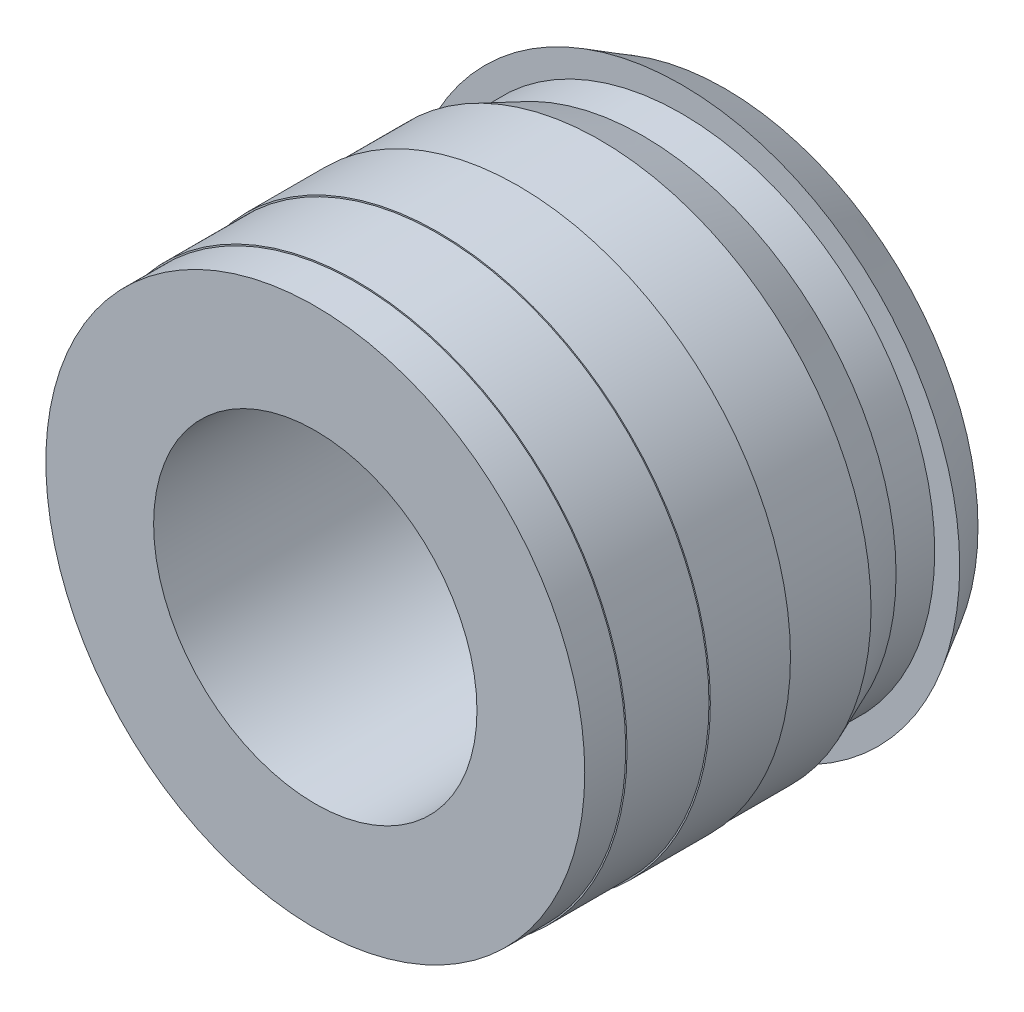
ISO-10303-21;
HEADER;
FILE_DESCRIPTION(('STEP AP214'),'2;1');
FILE_NAME('part.step','',(''),(''),'','','');
FILE_SCHEMA(('AUTOMOTIVE_DESIGN { 1 0 10303 214 1 1 1 1 }'));
ENDSEC;
DATA;
#1=APPLICATION_CONTEXT('core data for automotive mechanical design processes');
#2=APPLICATION_PROTOCOL_DEFINITION('international standard','automotive_design',2000,#1);
#3=PRODUCT_CONTEXT('',#1,'mechanical');
#4=PRODUCT('Part','Part','',(#3));
#5=PRODUCT_RELATED_PRODUCT_CATEGORY('part','',(#4));
#6=PRODUCT_DEFINITION_FORMATION('','',#4);
#7=PRODUCT_DEFINITION_CONTEXT('part definition',#1,'design');
#8=PRODUCT_DEFINITION('design','',#6,#7);
#9=PRODUCT_DEFINITION_SHAPE('','',#8);
#10=(LENGTH_UNIT() NAMED_UNIT(*) SI_UNIT(.MILLI.,.METRE.));
#11=(NAMED_UNIT(*) PLANE_ANGLE_UNIT() SI_UNIT($,.RADIAN.));
#12=(NAMED_UNIT(*) SI_UNIT($,.STERADIAN.) SOLID_ANGLE_UNIT());
#13=UNCERTAINTY_MEASURE_WITH_UNIT(LENGTH_MEASURE(1.E-05),#10,'distance_accuracy_value','');
#14=(GEOMETRIC_REPRESENTATION_CONTEXT(3) GLOBAL_UNCERTAINTY_ASSIGNED_CONTEXT((#13)) GLOBAL_UNIT_ASSIGNED_CONTEXT((#10,
#11,#12)) REPRESENTATION_CONTEXT('',''));
#15=CARTESIAN_POINT('',(0.,0.,0.));
#16=DIRECTION('',(0.,0.,1.));
#17=DIRECTION('',(1.,0.,0.));
#18=AXIS2_PLACEMENT_3D('',#15,#16,#17);
#19=CARTESIAN_POINT('',(0.,0.,1.9));
#20=DIRECTION('',(0.,0.,1.));
#21=DIRECTION('',(1.,0.,0.));
#22=AXIS2_PLACEMENT_3D('',#19,#20,#21);
#23=CYLINDRICAL_SURFACE('',#22,1.5);
#24=CARTESIAN_POINT('',(0.,0.,-1.9));
#25=DIRECTION('',(0.,0.,1.));
#26=DIRECTION('',(1.,0.,0.));
#27=AXIS2_PLACEMENT_3D('',#24,#25,#26);
#28=CIRCLE('',#27,1.5);
#29=CARTESIAN_POINT('',(1.5,0.,-1.9));
#30=VERTEX_POINT('',#29);
#31=EDGE_CURVE('E83',#30,#30,#28,.T.);
#32=ORIENTED_EDGE('',*,*,#31,.F.);
#33=EDGE_LOOP('',(#32));
#34=FACE_BOUND('',#33,.T.);
#35=CARTESIAN_POINT('',(0.,0.,1.9));
#36=DIRECTION('',(0.,0.,1.));
#37=DIRECTION('',(1.,0.,0.));
#38=AXIS2_PLACEMENT_3D('',#35,#36,#37);
#39=CIRCLE('',#38,1.5);
#40=CARTESIAN_POINT('',(1.5,0.,1.9));
#41=VERTEX_POINT('',#40);
#42=EDGE_CURVE('E10',#41,#41,#39,.T.);
#43=ORIENTED_EDGE('',*,*,#42,.T.);
#44=EDGE_LOOP('',(#43));
#45=FACE_BOUND('',#44,.T.);
#46=ADVANCED_FACE('F37',(#34,#45),#23,.F.);
#47=CARTESIAN_POINT('',(0.,1.5,1.9));
#48=DIRECTION('',(0.,0.,-1.));
#49=DIRECTION('',(-1.,0.,0.));
#50=AXIS2_PLACEMENT_3D('',#47,#48,#49);
#51=PLANE('',#50);
#52=ORIENTED_EDGE('',*,*,#42,.F.);
#53=EDGE_LOOP('',(#52));
#54=FACE_BOUND('',#53,.T.);
#55=CARTESIAN_POINT('',(0.,0.,1.9));
#56=DIRECTION('',(0.,0.,1.));
#57=DIRECTION('',(1.,0.,0.));
#58=AXIS2_PLACEMENT_3D('',#55,#56,#57);
#59=CIRCLE('',#58,2.5);
#60=CARTESIAN_POINT('',(2.5,0.,1.9));
#61=VERTEX_POINT('',#60);
#62=EDGE_CURVE('E43',#61,#61,#59,.T.);
#63=ORIENTED_EDGE('',*,*,#62,.T.);
#64=EDGE_LOOP('',(#63));
#65=FACE_BOUND('',#64,.T.);
#66=ADVANCED_FACE('F90',(#54,#65),#51,.F.);
#67=CARTESIAN_POINT('',(0.,0.,1.9));
#68=DIRECTION('',(0.,0.,1.));
#69=DIRECTION('',(1.,0.,0.));
#70=AXIS2_PLACEMENT_3D('',#67,#68,#69);
#71=CYLINDRICAL_SURFACE('',#70,2.5);
#72=ORIENTED_EDGE('',*,*,#62,.F.);
#73=EDGE_LOOP('',(#72));
#74=FACE_BOUND('',#73,.T.);
#75=CARTESIAN_POINT('',(0.,0.,1.52));
#76=DIRECTION('',(0.,0.,1.));
#77=DIRECTION('',(1.,0.,0.));
#78=AXIS2_PLACEMENT_3D('',#75,#76,#77);
#79=CIRCLE('',#78,2.5);
#80=CARTESIAN_POINT('',(2.5,0.,1.52));
#81=VERTEX_POINT('',#80);
#82=EDGE_CURVE('E47',#81,#81,#79,.T.);
#83=ORIENTED_EDGE('',*,*,#82,.T.);
#84=EDGE_LOOP('',(#83));
#85=FACE_BOUND('',#84,.T.);
#86=ADVANCED_FACE('F94',(#74,#85),#71,.T.);
#87=CARTESIAN_POINT('',(0.,2.5,1.52));
#88=DIRECTION('',(0.,0.,-1.));
#89=DIRECTION('',(-1.,0.,0.));
#90=AXIS2_PLACEMENT_3D('',#87,#88,#89);
#91=PLANE('',#90);
#92=ORIENTED_EDGE('',*,*,#82,.F.);
#93=EDGE_LOOP('',(#92));
#94=FACE_BOUND('',#93,.T.);
#95=CARTESIAN_POINT('',(0.,0.,1.52));
#96=DIRECTION('',(0.,0.,1.));
#97=DIRECTION('',(1.,0.,0.));
#98=AXIS2_PLACEMENT_3D('',#95,#96,#97);
#99=CIRCLE('',#98,2.5125);
#100=CARTESIAN_POINT('',(2.5125,0.,1.52));
#101=VERTEX_POINT('',#100);
#102=EDGE_CURVE('E51',#101,#101,#99,.T.);
#103=ORIENTED_EDGE('',*,*,#102,.T.);
#104=EDGE_LOOP('',(#103));
#105=FACE_BOUND('',#104,.T.);
#106=ADVANCED_FACE('F99',(#94,#105),#91,.F.);
#107=CARTESIAN_POINT('',(0.,0.,1.9));
#108=DIRECTION('',(0.,0.,1.));
#109=DIRECTION('',(1.,0.,0.));
#110=AXIS2_PLACEMENT_3D('',#107,#108,#109);
#111=CYLINDRICAL_SURFACE('',#110,2.5125);
#112=ORIENTED_EDGE('',*,*,#102,.F.);
#113=EDGE_LOOP('',(#112));
#114=FACE_BOUND('',#113,.T.);
#115=CARTESIAN_POINT('',(0.,0.,0.76));
#116=DIRECTION('',(0.,0.,1.));
#117=DIRECTION('',(1.,0.,0.));
#118=AXIS2_PLACEMENT_3D('',#115,#116,#117);
#119=CIRCLE('',#118,2.5125);
#120=CARTESIAN_POINT('',(2.5125,0.,0.76));
#121=VERTEX_POINT('',#120);
#122=EDGE_CURVE('E56',#121,#121,#119,.T.);
#123=ORIENTED_EDGE('',*,*,#122,.T.);
#124=EDGE_LOOP('',(#123));
#125=FACE_BOUND('',#124,.T.);
#126=ADVANCED_FACE('F105',(#114,#125),#111,.T.);
#127=CARTESIAN_POINT('',(0.,2.5125,0.76));
#128=DIRECTION('',(0.,0.,-1.));
#129=DIRECTION('',(-1.,0.,0.));
#130=AXIS2_PLACEMENT_3D('',#127,#128,#129);
#131=PLANE('',#130);
#132=ORIENTED_EDGE('',*,*,#122,.F.);
#133=EDGE_LOOP('',(#132));
#134=FACE_BOUND('',#133,.T.);
#135=CARTESIAN_POINT('',(0.,0.,0.76));
#136=DIRECTION('',(0.,0.,1.));
#137=DIRECTION('',(1.,0.,0.));
#138=AXIS2_PLACEMENT_3D('',#135,#136,#137);
#139=CIRCLE('',#138,2.525);
#140=CARTESIAN_POINT('',(2.525,0.,0.76));
#141=VERTEX_POINT('',#140);
#142=EDGE_CURVE('E59',#141,#141,#139,.T.);
#143=ORIENTED_EDGE('',*,*,#142,.T.);
#144=EDGE_LOOP('',(#143));
#145=FACE_BOUND('',#144,.T.);
#146=ADVANCED_FACE('F109',(#134,#145),#131,.F.);
#147=CARTESIAN_POINT('',(0.,0.,1.9));
#148=DIRECTION('',(0.,0.,1.));
#149=DIRECTION('',(1.,0.,0.));
#150=AXIS2_PLACEMENT_3D('',#147,#148,#149);
#151=CYLINDRICAL_SURFACE('',#150,2.525);
#152=ORIENTED_EDGE('',*,*,#142,.F.);
#153=EDGE_LOOP('',(#152));
#154=FACE_BOUND('',#153,.T.);
#155=CARTESIAN_POINT('',(0.,0.,0.0165345776197818));
#156=DIRECTION('',(0.,0.,1.));
#157=DIRECTION('',(1.,0.,0.));
#158=AXIS2_PLACEMENT_3D('',#155,#156,#157);
#159=CIRCLE('',#158,2.525);
#160=CARTESIAN_POINT('',(2.525,0.,0.0165345776197818));
#161=VERTEX_POINT('',#160);
#162=EDGE_CURVE('E62',#161,#161,#159,.T.);
#163=ORIENTED_EDGE('',*,*,#162,.T.);
#164=EDGE_LOOP('',(#163));
#165=FACE_BOUND('',#164,.T.);
#166=ADVANCED_FACE('F113',(#154,#165),#151,.T.);
#167=CARTESIAN_POINT('',(0.,2.525,0.0165345776197818));
#168=DIRECTION('',(0.,0.,1.));
#169=DIRECTION('',(1.,0.,0.));
#170=AXIS2_PLACEMENT_3D('',#167,#168,#169);
#171=PLANE('',#170);
#172=ORIENTED_EDGE('',*,*,#162,.F.);
#173=EDGE_LOOP('',(#172));
#174=FACE_BOUND('',#173,.T.);
#175=CARTESIAN_POINT('',(0.,0.,0.0165345776197818));
#176=DIRECTION('',(0.,0.,1.));
#177=DIRECTION('',(1.,0.,0.));
#178=AXIS2_PLACEMENT_3D('',#175,#176,#177);
#179=CIRCLE('',#178,2.5125);
#180=CARTESIAN_POINT('',(2.5125,0.,0.0165345776197818));
#181=VERTEX_POINT('',#180);
#182=EDGE_CURVE('E65',#181,#181,#179,.T.);
#183=ORIENTED_EDGE('',*,*,#182,.T.);
#184=EDGE_LOOP('',(#183));
#185=FACE_BOUND('',#184,.T.);
#186=ADVANCED_FACE('F117',(#174,#185),#171,.F.);
#187=CARTESIAN_POINT('',(0.,0.,1.9));
#188=DIRECTION('',(0.,0.,1.));
#189=DIRECTION('',(1.,0.,0.));
#190=AXIS2_PLACEMENT_3D('',#187,#188,#189);
#191=CYLINDRICAL_SURFACE('',#190,2.5125);
#192=ORIENTED_EDGE('',*,*,#182,.F.);
#193=EDGE_LOOP('',(#192));
#194=FACE_BOUND('',#193,.T.);
#195=CARTESIAN_POINT('',(0.,0.,-0.743465422380219));
#196=DIRECTION('',(0.,0.,1.));
#197=DIRECTION('',(1.,0.,0.));
#198=AXIS2_PLACEMENT_3D('',#195,#196,#197);
#199=CIRCLE('',#198,2.5125);
#200=CARTESIAN_POINT('',(2.5125,0.,-0.743465422380219));
#201=VERTEX_POINT('',#200);
#202=EDGE_CURVE('E68',#201,#201,#199,.T.);
#203=ORIENTED_EDGE('',*,*,#202,.T.);
#204=EDGE_LOOP('',(#203));
#205=FACE_BOUND('',#204,.T.);
#206=ADVANCED_FACE('F121',(#194,#205),#191,.T.);
#207=CARTESIAN_POINT('',(0.,0.,-1.14));
#208=DIRECTION('',(0.,0.,1.));
#209=DIRECTION('',(1.,0.,0.));
#210=AXIS2_PLACEMENT_3D('',#207,#208,#209);
#211=CONICAL_SURFACE('',#210,2.34825,0.392699081698724);
#212=ORIENTED_EDGE('',*,*,#202,.F.);
#213=EDGE_LOOP('',(#212));
#214=FACE_BOUND('',#213,.T.);
#215=CARTESIAN_POINT('',(0.,0.,-1.14));
#216=DIRECTION('',(0.,0.,1.));
#217=DIRECTION('',(1.,0.,0.));
#218=AXIS2_PLACEMENT_3D('',#215,#216,#217);
#219=CIRCLE('',#218,2.34825);
#220=CARTESIAN_POINT('',(2.34825,0.,-1.14));
#221=VERTEX_POINT('',#220);
#222=EDGE_CURVE('E71',#221,#221,#219,.T.);
#223=ORIENTED_EDGE('',*,*,#222,.T.);
#224=EDGE_LOOP('',(#223));
#225=FACE_BOUND('',#224,.T.);
#226=ADVANCED_FACE('F125',(#214,#225),#211,.T.);
#227=CARTESIAN_POINT('',(0.,0.,1.9));
#228=DIRECTION('',(0.,0.,1.));
#229=DIRECTION('',(1.,0.,0.));
#230=AXIS2_PLACEMENT_3D('',#227,#228,#229);
#231=CYLINDRICAL_SURFACE('',#230,2.34825);
#232=ORIENTED_EDGE('',*,*,#222,.F.);
#233=EDGE_LOOP('',(#232));
#234=FACE_BOUND('',#233,.T.);
#235=CARTESIAN_POINT('',(0.,0.,-1.49859722534591));
#236=DIRECTION('',(0.,0.,1.));
#237=DIRECTION('',(1.,0.,0.));
#238=AXIS2_PLACEMENT_3D('',#235,#236,#237);
#239=CIRCLE('',#238,2.34825);
#240=CARTESIAN_POINT('',(2.34825,0.,-1.49859722534591));
#241=VERTEX_POINT('',#240);
#242=EDGE_CURVE('E74',#241,#241,#239,.T.);
#243=ORIENTED_EDGE('',*,*,#242,.T.);
#244=EDGE_LOOP('',(#243));
#245=FACE_BOUND('',#244,.T.);
#246=ADVANCED_FACE('F129',(#234,#245),#231,.T.);
#247=CARTESIAN_POINT('',(0.,2.34825,-1.49859722534591));
#248=DIRECTION('',(0.,0.,-1.));
#249=DIRECTION('',(-1.,0.,0.));
#250=AXIS2_PLACEMENT_3D('',#247,#248,#249);
#251=PLANE('',#250);
#252=ORIENTED_EDGE('',*,*,#242,.F.);
#253=EDGE_LOOP('',(#252));
#254=FACE_BOUND('',#253,.T.);
#255=CARTESIAN_POINT('',(0.,0.,-1.49859722534591));
#256=DIRECTION('',(0.,0.,1.));
#257=DIRECTION('',(1.,0.,0.));
#258=AXIS2_PLACEMENT_3D('',#255,#256,#257);
#259=CIRCLE('',#258,2.58);
#260=CARTESIAN_POINT('',(2.58,0.,-1.49859722534591));
#261=VERTEX_POINT('',#260);
#262=EDGE_CURVE('E77',#261,#261,#259,.T.);
#263=ORIENTED_EDGE('',*,*,#262,.T.);
#264=EDGE_LOOP('',(#263));
#265=FACE_BOUND('',#264,.T.);
#266=ADVANCED_FACE('F133',(#254,#265),#251,.F.);
#267=CARTESIAN_POINT('',(0.,0.,-1.9));
#268=DIRECTION('',(0.,0.,1.));
#269=DIRECTION('',(1.,0.,0.));
#270=AXIS2_PLACEMENT_3D('',#267,#268,#269);
#271=CONICAL_SURFACE('',#270,2.34825,0.523598775598301);
#272=ORIENTED_EDGE('',*,*,#262,.F.);
#273=EDGE_LOOP('',(#272));
#274=FACE_BOUND('',#273,.T.);
#275=CARTESIAN_POINT('',(0.,0.,-1.9));
#276=DIRECTION('',(0.,0.,1.));
#277=DIRECTION('',(1.,0.,0.));
#278=AXIS2_PLACEMENT_3D('',#275,#276,#277);
#279=CIRCLE('',#278,2.34825);
#280=CARTESIAN_POINT('',(2.34825,0.,-1.9));
#281=VERTEX_POINT('',#280);
#282=EDGE_CURVE('E80',#281,#281,#279,.T.);
#283=ORIENTED_EDGE('',*,*,#282,.T.);
#284=EDGE_LOOP('',(#283));
#285=FACE_BOUND('',#284,.T.);
#286=ADVANCED_FACE('F137',(#274,#285),#271,.T.);
#287=CARTESIAN_POINT('',(0.,2.34825,-1.9));
#288=DIRECTION('',(0.,0.,1.));
#289=DIRECTION('',(1.,0.,0.));
#290=AXIS2_PLACEMENT_3D('',#287,#288,#289);
#291=PLANE('',#290);
#292=ORIENTED_EDGE('',*,*,#282,.F.);
#293=EDGE_LOOP('',(#292));
#294=FACE_BOUND('',#293,.T.);
#295=ORIENTED_EDGE('',*,*,#31,.T.);
#296=EDGE_LOOP('',(#295));
#297=FACE_BOUND('',#296,.T.);
#298=ADVANCED_FACE('F87',(#294,#297),#291,.F.);
#299=CLOSED_SHELL('',(#46,#66,#86,#106,#126,#146,#166,#186,#206,#226,#246,#266,#286,#298));
#300=MANIFOLD_SOLID_BREP('B2',#299);
#301=ADVANCED_BREP_SHAPE_REPRESENTATION('',(#18,#300),#14);
#302=SHAPE_DEFINITION_REPRESENTATION(#9,#301);
ENDSEC;
END-ISO-10303-21;
